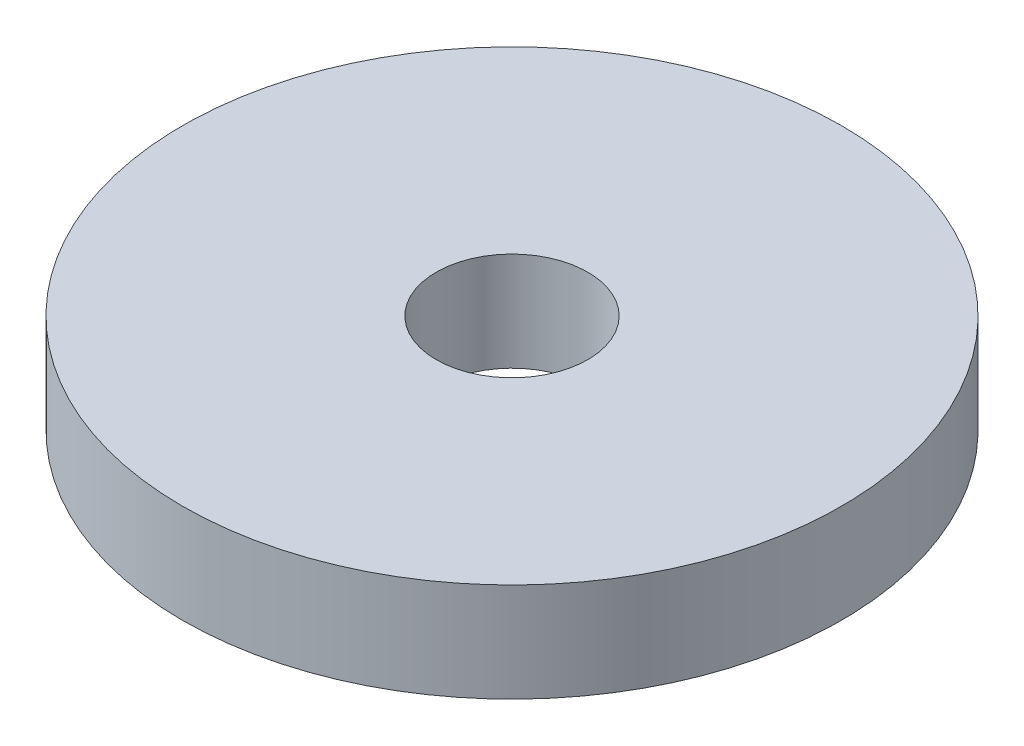
ISO-10303-21;
HEADER;
FILE_DESCRIPTION(('STEP AP214'),'2;1');
FILE_NAME('part.step','',(''),(''),'','','');
FILE_SCHEMA(('AUTOMOTIVE_DESIGN { 1 0 10303 214 1 1 1 1 }'));
ENDSEC;
DATA;
#1=APPLICATION_CONTEXT('core data for automotive mechanical design processes');
#2=APPLICATION_PROTOCOL_DEFINITION('international standard','automotive_design',2000,#1);
#3=PRODUCT_CONTEXT('',#1,'mechanical');
#4=PRODUCT('Part','Part','',(#3));
#5=PRODUCT_RELATED_PRODUCT_CATEGORY('part','',(#4));
#6=PRODUCT_DEFINITION_FORMATION('','',#4);
#7=PRODUCT_DEFINITION_CONTEXT('part definition',#1,'design');
#8=PRODUCT_DEFINITION('design','',#6,#7);
#9=PRODUCT_DEFINITION_SHAPE('','',#8);
#10=(LENGTH_UNIT() NAMED_UNIT(*) SI_UNIT(.MILLI.,.METRE.));
#11=(NAMED_UNIT(*) PLANE_ANGLE_UNIT() SI_UNIT($,.RADIAN.));
#12=(NAMED_UNIT(*) SI_UNIT($,.STERADIAN.) SOLID_ANGLE_UNIT());
#13=UNCERTAINTY_MEASURE_WITH_UNIT(LENGTH_MEASURE(1.E-05),#10,'distance_accuracy_value','');
#14=(GEOMETRIC_REPRESENTATION_CONTEXT(3) GLOBAL_UNCERTAINTY_ASSIGNED_CONTEXT((#13)) GLOBAL_UNIT_ASSIGNED_CONTEXT((#10,
#11,#12)) REPRESENTATION_CONTEXT('',''));
#15=CARTESIAN_POINT('',(0.,0.,0.));
#16=DIRECTION('',(0.,0.,1.));
#17=DIRECTION('',(1.,0.,0.));
#18=AXIS2_PLACEMENT_3D('',#15,#16,#17);
#19=CARTESIAN_POINT('',(0.,3.,0.));
#20=DIRECTION('',(0.,1.,0.));
#21=DIRECTION('',(0.,0.,1.));
#22=AXIS2_PLACEMENT_3D('',#19,#20,#21);
#23=PLANE('',#22);
#24=CARTESIAN_POINT('',(0.,3.,0.));
#25=DIRECTION('',(0.,1.,0.));
#26=DIRECTION('',(0.,0.,1.));
#27=AXIS2_PLACEMENT_3D('',#24,#25,#26);
#28=CIRCLE('',#27,10.);
#29=CARTESIAN_POINT('',(0.,3.,10.));
#30=VERTEX_POINT('',#29);
#31=EDGE_CURVE('E10',#30,#30,#28,.T.);
#32=ORIENTED_EDGE('',*,*,#31,.T.);
#33=EDGE_LOOP('',(#32));
#34=FACE_BOUND('',#33,.T.);
#35=CARTESIAN_POINT('',(0.,3.,0.));
#36=DIRECTION('',(0.,1.,0.));
#37=DIRECTION('',(0.,0.,1.));
#38=AXIS2_PLACEMENT_3D('',#35,#36,#37);
#39=CIRCLE('',#38,2.3);
#40=CARTESIAN_POINT('',(0.,3.,2.3));
#41=VERTEX_POINT('',#40);
#42=EDGE_CURVE('E48',#41,#41,#39,.T.);
#43=ORIENTED_EDGE('',*,*,#42,.F.);
#44=EDGE_LOOP('',(#43));
#45=FACE_BOUND('',#44,.T.);
#46=ADVANCED_FACE('F37',(#34,#45),#23,.T.);
#47=CARTESIAN_POINT('',(0.,0.,0.));
#48=DIRECTION('',(0.,1.,0.));
#49=DIRECTION('',(0.,0.,1.));
#50=AXIS2_PLACEMENT_3D('',#47,#48,#49);
#51=PLANE('',#50);
#52=CARTESIAN_POINT('',(0.,0.,0.));
#53=DIRECTION('',(0.,1.,0.));
#54=DIRECTION('',(0.,0.,1.));
#55=AXIS2_PLACEMENT_3D('',#52,#53,#54);
#56=CIRCLE('',#55,10.);
#57=CARTESIAN_POINT('',(0.,0.,10.));
#58=VERTEX_POINT('',#57);
#59=EDGE_CURVE('E41',#58,#58,#56,.T.);
#60=ORIENTED_EDGE('',*,*,#59,.F.);
#61=EDGE_LOOP('',(#60));
#62=FACE_BOUND('',#61,.T.);
#63=CARTESIAN_POINT('',(0.,0.,0.));
#64=DIRECTION('',(0.,1.,0.));
#65=DIRECTION('',(0.,0.,1.));
#66=AXIS2_PLACEMENT_3D('',#63,#64,#65);
#67=CIRCLE('',#66,2.3);
#68=CARTESIAN_POINT('',(0.,0.,2.3));
#69=VERTEX_POINT('',#68);
#70=EDGE_CURVE('E50',#69,#69,#67,.T.);
#71=ORIENTED_EDGE('',*,*,#70,.T.);
#72=EDGE_LOOP('',(#71));
#73=FACE_BOUND('',#72,.T.);
#74=ADVANCED_FACE('F60',(#62,#73),#51,.F.);
#75=CARTESIAN_POINT('',(0.,3.,0.));
#76=DIRECTION('',(0.,-1.,0.));
#77=DIRECTION('',(0.,0.,-1.));
#78=AXIS2_PLACEMENT_3D('',#75,#76,#77);
#79=CYLINDRICAL_SURFACE('',#78,10.);
#80=ORIENTED_EDGE('',*,*,#31,.F.);
#81=EDGE_LOOP('',(#80));
#82=FACE_BOUND('',#81,.T.);
#83=ORIENTED_EDGE('',*,*,#59,.T.);
#84=EDGE_LOOP('',(#83));
#85=FACE_BOUND('',#84,.T.);
#86=ADVANCED_FACE('F39',(#82,#85),#79,.T.);
#87=CARTESIAN_POINT('',(0.,3.,0.));
#88=DIRECTION('',(0.,-1.,0.));
#89=DIRECTION('',(0.,0.,-1.));
#90=AXIS2_PLACEMENT_3D('',#87,#88,#89);
#91=CYLINDRICAL_SURFACE('',#90,2.3);
#92=ORIENTED_EDGE('',*,*,#42,.T.);
#93=EDGE_LOOP('',(#92));
#94=FACE_BOUND('',#93,.T.);
#95=ORIENTED_EDGE('',*,*,#70,.F.);
#96=EDGE_LOOP('',(#95));
#97=FACE_BOUND('',#96,.T.);
#98=ADVANCED_FACE('F56',(#94,#97),#91,.F.);
#99=CLOSED_SHELL('',(#46,#74,#86,#98));
#100=MANIFOLD_SOLID_BREP('B2',#99);
#101=ADVANCED_BREP_SHAPE_REPRESENTATION('',(#18,#100),#14);
#102=SHAPE_DEFINITION_REPRESENTATION(#9,#101);
ENDSEC;
END-ISO-10303-21;
